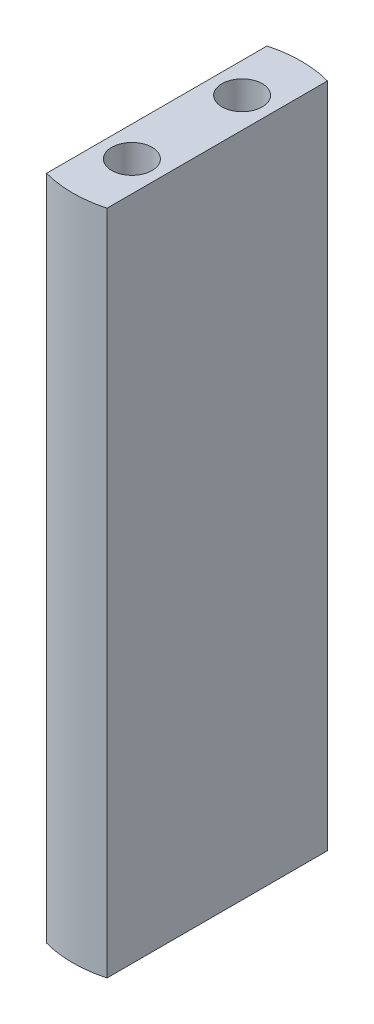
ISO-10303-21;
HEADER;
FILE_DESCRIPTION(('STEP AP214'),'2;1');
FILE_NAME('part.step','',(''),(''),'','','');
FILE_SCHEMA(('AUTOMOTIVE_DESIGN { 1 0 10303 214 1 1 1 1 }'));
ENDSEC;
DATA;
#1=APPLICATION_CONTEXT('core data for automotive mechanical design processes');
#2=APPLICATION_PROTOCOL_DEFINITION('international standard','automotive_design',2000,#1);
#3=PRODUCT_CONTEXT('',#1,'mechanical');
#4=PRODUCT('Part','Part','',(#3));
#5=PRODUCT_RELATED_PRODUCT_CATEGORY('part','',(#4));
#6=PRODUCT_DEFINITION_FORMATION('','',#4);
#7=PRODUCT_DEFINITION_CONTEXT('part definition',#1,'design');
#8=PRODUCT_DEFINITION('design','',#6,#7);
#9=PRODUCT_DEFINITION_SHAPE('','',#8);
#10=(LENGTH_UNIT() NAMED_UNIT(*) SI_UNIT(.MILLI.,.METRE.));
#11=(NAMED_UNIT(*) PLANE_ANGLE_UNIT() SI_UNIT($,.RADIAN.));
#12=(NAMED_UNIT(*) SI_UNIT($,.STERADIAN.) SOLID_ANGLE_UNIT());
#13=UNCERTAINTY_MEASURE_WITH_UNIT(LENGTH_MEASURE(1.E-05),#10,'distance_accuracy_value','');
#14=(GEOMETRIC_REPRESENTATION_CONTEXT(3) GLOBAL_UNCERTAINTY_ASSIGNED_CONTEXT((#13)) GLOBAL_UNIT_ASSIGNED_CONTEXT((#10,
#11,#12)) REPRESENTATION_CONTEXT('',''));
#15=CARTESIAN_POINT('',(0.,0.,0.));
#16=DIRECTION('',(0.,0.,1.));
#17=DIRECTION('',(1.,0.,0.));
#18=AXIS2_PLACEMENT_3D('',#15,#16,#17);
#19=CARTESIAN_POINT('',(9.525,210.,0.));
#20=DIRECTION('',(1.,0.,0.));
#21=DIRECTION('',(0.,0.,-1.));
#22=AXIS2_PLACEMENT_3D('',#19,#20,#21);
#23=PLANE('',#22);
#24=DIRECTION('',(0.,0.,1.));
#25=VECTOR('',#24,1.);
#26=CARTESIAN_POINT('',(9.525,0.,0.));
#27=LINE('',#26,#25);
#28=CARTESIAN_POINT('',(9.525,0.,-34.717061727629));
#29=VERTEX_POINT('',#28);
#30=CARTESIAN_POINT('',(9.525,0.,34.717061727629));
#31=VERTEX_POINT('',#30);
#32=EDGE_CURVE('E121',#29,#31,#27,.T.);
#33=ORIENTED_EDGE('',*,*,#32,.F.);
#34=DIRECTION('',(0.,-1.,0.));
#35=VECTOR('',#34,1.);
#36=CARTESIAN_POINT('',(9.525,210.,-34.717061727629));
#37=LINE('',#36,#35);
#38=CARTESIAN_POINT('',(9.525,210.,-34.717061727629));
#39=VERTEX_POINT('',#38);
#40=EDGE_CURVE('E11',#39,#29,#37,.T.);
#41=ORIENTED_EDGE('',*,*,#40,.F.);
#42=DIRECTION('',(0.,0.,1.));
#43=VECTOR('',#42,1.);
#44=CARTESIAN_POINT('',(9.525,210.,0.));
#45=LINE('',#44,#43);
#46=CARTESIAN_POINT('',(9.525,210.,34.717061727629));
#47=VERTEX_POINT('',#46);
#48=EDGE_CURVE('E103',#39,#47,#45,.T.);
#49=ORIENTED_EDGE('',*,*,#48,.T.);
#50=DIRECTION('',(0.,-1.,0.));
#51=VECTOR('',#50,1.);
#52=CARTESIAN_POINT('',(9.525,210.,34.717061727629));
#53=LINE('',#52,#51);
#54=EDGE_CURVE('E84',#47,#31,#53,.T.);
#55=ORIENTED_EDGE('',*,*,#54,.T.);
#56=EDGE_LOOP('',(#33,#41,#49,#55));
#57=FACE_BOUND('',#56,.T.);
#58=ADVANCED_FACE('F45',(#57),#23,.T.);
#59=CARTESIAN_POINT('',(0.,210.,0.));
#60=DIRECTION('',(0.,-1.,0.));
#61=DIRECTION('',(0.,0.,-1.));
#62=AXIS2_PLACEMENT_3D('',#59,#60,#61);
#63=CYLINDRICAL_SURFACE('',#62,36.);
#64=CARTESIAN_POINT('',(0.,0.,0.));
#65=DIRECTION('',(0.,1.,0.));
#66=DIRECTION('',(0.,0.,1.));
#67=AXIS2_PLACEMENT_3D('',#64,#65,#66);
#68=CIRCLE('',#67,36.);
#69=CARTESIAN_POINT('',(-9.525,0.,-34.717061727629));
#70=VERTEX_POINT('',#69);
#71=EDGE_CURVE('E108',#29,#70,#68,.T.);
#72=ORIENTED_EDGE('',*,*,#71,.T.);
#73=DIRECTION('',(0.,-1.,0.));
#74=VECTOR('',#73,1.);
#75=CARTESIAN_POINT('',(-9.525,210.,-34.717061727629));
#76=LINE('',#75,#74);
#77=CARTESIAN_POINT('',(-9.525,210.,-34.717061727629));
#78=VERTEX_POINT('',#77);
#79=EDGE_CURVE('E54',#78,#70,#76,.T.);
#80=ORIENTED_EDGE('',*,*,#79,.F.);
#81=CARTESIAN_POINT('',(0.,210.,0.));
#82=DIRECTION('',(0.,1.,0.));
#83=DIRECTION('',(0.,0.,1.));
#84=AXIS2_PLACEMENT_3D('',#81,#82,#83);
#85=CIRCLE('',#84,36.);
#86=EDGE_CURVE('E99',#39,#78,#85,.T.);
#87=ORIENTED_EDGE('',*,*,#86,.F.);
#88=ORIENTED_EDGE('',*,*,#40,.T.);
#89=EDGE_LOOP('',(#72,#80,#87,#88));
#90=FACE_BOUND('',#89,.T.);
#91=ADVANCED_FACE('F106',(#90),#63,.T.);
#92=CARTESIAN_POINT('',(-9.525,210.,0.));
#93=DIRECTION('',(1.,0.,0.));
#94=DIRECTION('',(0.,0.,-1.));
#95=AXIS2_PLACEMENT_3D('',#92,#93,#94);
#96=PLANE('',#95);
#97=DIRECTION('',(0.,0.,1.));
#98=VECTOR('',#97,1.);
#99=CARTESIAN_POINT('',(-9.525,0.,0.));
#100=LINE('',#99,#98);
#101=CARTESIAN_POINT('',(-9.525,0.,34.717061727629));
#102=VERTEX_POINT('',#101);
#103=EDGE_CURVE('E118',#70,#102,#100,.T.);
#104=ORIENTED_EDGE('',*,*,#103,.T.);
#105=DIRECTION('',(0.,-1.,0.));
#106=VECTOR('',#105,1.);
#107=CARTESIAN_POINT('',(-9.525,210.,34.717061727629));
#108=LINE('',#107,#106);
#109=CARTESIAN_POINT('',(-9.525,210.,34.717061727629));
#110=VERTEX_POINT('',#109);
#111=EDGE_CURVE('E98',#110,#102,#108,.T.);
#112=ORIENTED_EDGE('',*,*,#111,.F.);
#113=DIRECTION('',(0.,0.,1.));
#114=VECTOR('',#113,1.);
#115=CARTESIAN_POINT('',(-9.525,210.,0.));
#116=LINE('',#115,#114);
#117=EDGE_CURVE('E92',#78,#110,#116,.T.);
#118=ORIENTED_EDGE('',*,*,#117,.F.);
#119=ORIENTED_EDGE('',*,*,#79,.T.);
#120=EDGE_LOOP('',(#104,#112,#118,#119));
#121=FACE_BOUND('',#120,.T.);
#122=ADVANCED_FACE('F95',(#121),#96,.F.);
#123=CARTESIAN_POINT('',(0.,210.,0.));
#124=DIRECTION('',(0.,-1.,0.));
#125=DIRECTION('',(0.,0.,-1.));
#126=AXIS2_PLACEMENT_3D('',#123,#124,#125);
#127=CYLINDRICAL_SURFACE('',#126,36.);
#128=CARTESIAN_POINT('',(0.,0.,0.));
#129=DIRECTION('',(0.,1.,0.));
#130=DIRECTION('',(0.,0.,1.));
#131=AXIS2_PLACEMENT_3D('',#128,#129,#130);
#132=CIRCLE('',#131,36.);
#133=EDGE_CURVE('E77',#102,#31,#132,.T.);
#134=ORIENTED_EDGE('',*,*,#133,.T.);
#135=ORIENTED_EDGE('',*,*,#54,.F.);
#136=CARTESIAN_POINT('',(0.,210.,0.));
#137=DIRECTION('',(0.,1.,0.));
#138=DIRECTION('',(0.,0.,1.));
#139=AXIS2_PLACEMENT_3D('',#136,#137,#138);
#140=CIRCLE('',#139,36.);
#141=EDGE_CURVE('E62',#110,#47,#140,.T.);
#142=ORIENTED_EDGE('',*,*,#141,.F.);
#143=ORIENTED_EDGE('',*,*,#111,.T.);
#144=EDGE_LOOP('',(#134,#135,#142,#143));
#145=FACE_BOUND('',#144,.T.);
#146=ADVANCED_FACE('F137',(#145),#127,.T.);
#147=CARTESIAN_POINT('',(0.,210.,17.3585308638145));
#148=DIRECTION('',(0.,-1.,0.));
#149=DIRECTION('',(0.,0.,-1.));
#150=AXIS2_PLACEMENT_3D('',#147,#148,#149);
#151=CYLINDRICAL_SURFACE('',#150,6.35);
#152=CARTESIAN_POINT('',(0.,210.,17.3585308638145));
#153=DIRECTION('',(0.,1.,0.));
#154=DIRECTION('',(0.,0.,1.));
#155=AXIS2_PLACEMENT_3D('',#152,#153,#154);
#156=CIRCLE('',#155,6.35);
#157=CARTESIAN_POINT('',(0.,210.,23.7085308638145));
#158=VERTEX_POINT('',#157);
#159=EDGE_CURVE('E116',#158,#158,#156,.F.);
#160=ORIENTED_EDGE('',*,*,#159,.F.);
#161=EDGE_LOOP('',(#160));
#162=FACE_BOUND('',#161,.T.);
#163=CARTESIAN_POINT('',(0.,0.,17.3585308638145));
#164=DIRECTION('',(0.,1.,0.));
#165=DIRECTION('',(0.,0.,1.));
#166=AXIS2_PLACEMENT_3D('',#163,#164,#165);
#167=CIRCLE('',#166,6.35);
#168=CARTESIAN_POINT('',(0.,0.,23.7085308638145));
#169=VERTEX_POINT('',#168);
#170=EDGE_CURVE('E123',#169,#169,#167,.F.);
#171=ORIENTED_EDGE('',*,*,#170,.T.);
#172=EDGE_LOOP('',(#171));
#173=FACE_BOUND('',#172,.T.);
#174=ADVANCED_FACE('F47',(#162,#173),#151,.F.);
#175=CARTESIAN_POINT('',(0.,210.,-17.3585308638145));
#176=DIRECTION('',(0.,-1.,0.));
#177=DIRECTION('',(0.,0.,-1.));
#178=AXIS2_PLACEMENT_3D('',#175,#176,#177);
#179=CYLINDRICAL_SURFACE('',#178,6.35);
#180=CARTESIAN_POINT('',(0.,210.,-17.3585308638145));
#181=DIRECTION('',(0.,1.,0.));
#182=DIRECTION('',(0.,0.,1.));
#183=AXIS2_PLACEMENT_3D('',#180,#181,#182);
#184=CIRCLE('',#183,6.35);
#185=CARTESIAN_POINT('',(0.,210.,-11.0085308638145));
#186=VERTEX_POINT('',#185);
#187=EDGE_CURVE('E112',#186,#186,#184,.T.);
#188=ORIENTED_EDGE('',*,*,#187,.T.);
#189=EDGE_LOOP('',(#188));
#190=FACE_BOUND('',#189,.T.);
#191=CARTESIAN_POINT('',(0.,0.,-17.3585308638145));
#192=DIRECTION('',(0.,1.,0.));
#193=DIRECTION('',(0.,0.,1.));
#194=AXIS2_PLACEMENT_3D('',#191,#192,#193);
#195=CIRCLE('',#194,6.35);
#196=CARTESIAN_POINT('',(0.,0.,-11.0085308638145));
#197=VERTEX_POINT('',#196);
#198=EDGE_CURVE('E113',#197,#197,#195,.T.);
#199=ORIENTED_EDGE('',*,*,#198,.F.);
#200=EDGE_LOOP('',(#199));
#201=FACE_BOUND('',#200,.T.);
#202=ADVANCED_FACE('F136',(#190,#201),#179,.F.);
#203=CARTESIAN_POINT('',(0.,210.,0.));
#204=DIRECTION('',(0.,1.,0.));
#205=DIRECTION('',(0.,0.,1.));
#206=AXIS2_PLACEMENT_3D('',#203,#204,#205);
#207=PLANE('',#206);
#208=ORIENTED_EDGE('',*,*,#159,.T.);
#209=EDGE_LOOP('',(#208));
#210=FACE_BOUND('',#209,.T.);
#211=ORIENTED_EDGE('',*,*,#48,.F.);
#212=ORIENTED_EDGE('',*,*,#86,.T.);
#213=ORIENTED_EDGE('',*,*,#117,.T.);
#214=ORIENTED_EDGE('',*,*,#141,.T.);
#215=EDGE_LOOP('',(#211,#212,#213,#214));
#216=FACE_BOUND('',#215,.T.);
#217=ORIENTED_EDGE('',*,*,#187,.F.);
#218=EDGE_LOOP('',(#217));
#219=FACE_BOUND('',#218,.T.);
#220=ADVANCED_FACE('F101',(#210,#216,#219),#207,.T.);
#221=CARTESIAN_POINT('',(0.,0.,0.));
#222=DIRECTION('',(0.,1.,0.));
#223=DIRECTION('',(0.,0.,1.));
#224=AXIS2_PLACEMENT_3D('',#221,#222,#223);
#225=PLANE('',#224);
#226=ORIENTED_EDGE('',*,*,#170,.F.);
#227=EDGE_LOOP('',(#226));
#228=FACE_BOUND('',#227,.T.);
#229=ORIENTED_EDGE('',*,*,#32,.T.);
#230=ORIENTED_EDGE('',*,*,#133,.F.);
#231=ORIENTED_EDGE('',*,*,#103,.F.);
#232=ORIENTED_EDGE('',*,*,#71,.F.);
#233=EDGE_LOOP('',(#229,#230,#231,#232));
#234=FACE_BOUND('',#233,.T.);
#235=ORIENTED_EDGE('',*,*,#198,.T.);
#236=EDGE_LOOP('',(#235));
#237=FACE_BOUND('',#236,.T.);
#238=ADVANCED_FACE('F140',(#228,#234,#237),#225,.F.);
#239=CLOSED_SHELL('',(#58,#91,#122,#146,#174,#202,#220,#238));
#240=MANIFOLD_SOLID_BREP('B2',#239);
#241=ADVANCED_BREP_SHAPE_REPRESENTATION('',(#18,#240),#14);
#242=SHAPE_DEFINITION_REPRESENTATION(#9,#241);
ENDSEC;
END-ISO-10303-21;
